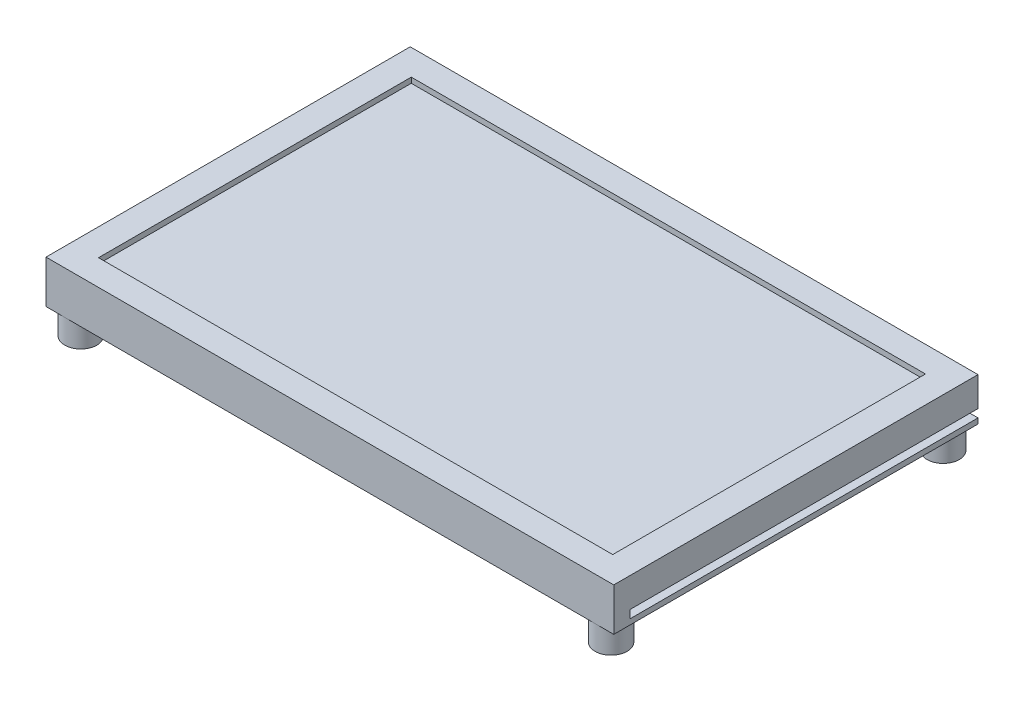
ISO-10303-21;
HEADER;
FILE_DESCRIPTION(('STEP AP214'),'2;1');
FILE_NAME('part.step','',(''),(''),'','','');
FILE_SCHEMA(('AUTOMOTIVE_DESIGN { 1 0 10303 214 1 1 1 1 }'));
ENDSEC;
DATA;
#1=APPLICATION_CONTEXT('core data for automotive mechanical design processes');
#2=APPLICATION_PROTOCOL_DEFINITION('international standard','automotive_design',2000,#1);
#3=PRODUCT_CONTEXT('',#1,'mechanical');
#4=PRODUCT('Part','Part','',(#3));
#5=PRODUCT_RELATED_PRODUCT_CATEGORY('part','',(#4));
#6=PRODUCT_DEFINITION_FORMATION('','',#4);
#7=PRODUCT_DEFINITION_CONTEXT('part definition',#1,'design');
#8=PRODUCT_DEFINITION('design','',#6,#7);
#9=PRODUCT_DEFINITION_SHAPE('','',#8);
#10=(LENGTH_UNIT() NAMED_UNIT(*) SI_UNIT(.MILLI.,.METRE.));
#11=(NAMED_UNIT(*) PLANE_ANGLE_UNIT() SI_UNIT($,.RADIAN.));
#12=(NAMED_UNIT(*) SI_UNIT($,.STERADIAN.) SOLID_ANGLE_UNIT());
#13=UNCERTAINTY_MEASURE_WITH_UNIT(LENGTH_MEASURE(1.E-05),#10,'distance_accuracy_value','');
#14=(GEOMETRIC_REPRESENTATION_CONTEXT(3) GLOBAL_UNCERTAINTY_ASSIGNED_CONTEXT((#13)) GLOBAL_UNIT_ASSIGNED_CONTEXT((#10,
#11,#12)) REPRESENTATION_CONTEXT('',''));
#15=CARTESIAN_POINT('',(0.,0.,0.));
#16=DIRECTION('',(0.,0.,1.));
#17=DIRECTION('',(1.,0.,0.));
#18=AXIS2_PLACEMENT_3D('',#15,#16,#17);
#19=CARTESIAN_POINT('',(-53.,8.,-34.));
#20=DIRECTION('',(0.,0.,1.));
#21=DIRECTION('',(1.,0.,0.));
#22=AXIS2_PLACEMENT_3D('',#19,#20,#21);
#23=PLANE('',#22);
#24=DIRECTION('',(0.,-1.,0.));
#25=VECTOR('',#24,1.);
#26=CARTESIAN_POINT('',(53.,8.,-34.));
#27=LINE('',#26,#25);
#28=CARTESIAN_POINT('',(53.,8.,-34.));
#29=VERTEX_POINT('',#28);
#30=CARTESIAN_POINT('',(53.,2.5,-34.));
#31=VERTEX_POINT('',#30);
#32=EDGE_CURVE('E364',#29,#31,#27,.T.);
#33=ORIENTED_EDGE('',*,*,#32,.T.);
#34=DIRECTION('',(1.,0.,0.));
#35=VECTOR('',#34,1.);
#36=CARTESIAN_POINT('',(53.,2.5,-34.));
#37=LINE('',#36,#35);
#38=CARTESIAN_POINT('',(-53.,2.5,-34.));
#39=VERTEX_POINT('',#38);
#40=EDGE_CURVE('E212',#39,#31,#37,.T.);
#41=ORIENTED_EDGE('',*,*,#40,.F.);
#42=DIRECTION('',(0.,-1.,0.));
#43=VECTOR('',#42,1.);
#44=CARTESIAN_POINT('',(-53.,8.,-34.));
#45=LINE('',#44,#43);
#46=CARTESIAN_POINT('',(-53.,8.,-34.));
#47=VERTEX_POINT('',#46);
#48=EDGE_CURVE('E360',#47,#39,#45,.T.);
#49=ORIENTED_EDGE('',*,*,#48,.F.);
#50=DIRECTION('',(-1.,0.,0.));
#51=VECTOR('',#50,1.);
#52=CARTESIAN_POINT('',(-53.,8.,-34.));
#53=LINE('',#52,#51);
#54=EDGE_CURVE('E335',#29,#47,#53,.T.);
#55=ORIENTED_EDGE('',*,*,#54,.F.);
#56=EDGE_LOOP('',(#33,#41,#49,#55));
#57=FACE_BOUND('',#56,.T.);
#58=ADVANCED_FACE('F43',(#57),#23,.F.);
#59=CARTESIAN_POINT('',(53.,8.,-34.));
#60=DIRECTION('',(-1.,0.,0.));
#61=DIRECTION('',(0.,0.,1.));
#62=AXIS2_PLACEMENT_3D('',#59,#60,#61);
#63=PLANE('',#62);
#64=DIRECTION('',(0.,-1.,0.));
#65=VECTOR('',#64,1.);
#66=CARTESIAN_POINT('',(53.,1.,31.));
#67=LINE('',#66,#65);
#68=CARTESIAN_POINT('',(53.,2.5,31.));
#69=VERTEX_POINT('',#68);
#70=CARTESIAN_POINT('',(53.,1.,31.));
#71=VERTEX_POINT('',#70);
#72=EDGE_CURVE('E208',#69,#71,#67,.T.);
#73=ORIENTED_EDGE('',*,*,#72,.F.);
#74=DIRECTION('',(0.,0.,-1.));
#75=VECTOR('',#74,1.);
#76=CARTESIAN_POINT('',(53.,2.5,31.));
#77=LINE('',#76,#75);
#78=EDGE_CURVE('E225',#69,#31,#77,.T.);
#79=ORIENTED_EDGE('',*,*,#78,.T.);
#80=ORIENTED_EDGE('',*,*,#32,.F.);
#81=DIRECTION('',(0.,0.,-1.));
#82=VECTOR('',#81,1.);
#83=CARTESIAN_POINT('',(53.,8.,-34.));
#84=LINE('',#83,#82);
#85=CARTESIAN_POINT('',(53.,8.,34.));
#86=VERTEX_POINT('',#85);
#87=EDGE_CURVE('E332',#86,#29,#84,.T.);
#88=ORIENTED_EDGE('',*,*,#87,.F.);
#89=DIRECTION('',(0.,-1.,0.));
#90=VECTOR('',#89,1.);
#91=CARTESIAN_POINT('',(53.,8.,34.));
#92=LINE('',#91,#90);
#93=CARTESIAN_POINT('',(53.,0.,34.));
#94=VERTEX_POINT('',#93);
#95=EDGE_CURVE('E342',#86,#94,#92,.T.);
#96=ORIENTED_EDGE('',*,*,#95,.T.);
#97=DIRECTION('',(0.,0.,-1.));
#98=VECTOR('',#97,1.);
#99=CARTESIAN_POINT('',(53.,0.,-34.));
#100=LINE('',#99,#98);
#101=CARTESIAN_POINT('',(53.,0.,-34.));
#102=VERTEX_POINT('',#101);
#103=EDGE_CURVE('E329',#94,#102,#100,.T.);
#104=ORIENTED_EDGE('',*,*,#103,.T.);
#105=CARTESIAN_POINT('',(53.,1.,-34.));
#106=VERTEX_POINT('',#105);
#107=EDGE_CURVE('E363',#106,#102,#27,.T.);
#108=ORIENTED_EDGE('',*,*,#107,.F.);
#109=DIRECTION('',(0.,0.,-1.));
#110=VECTOR('',#109,1.);
#111=CARTESIAN_POINT('',(53.,1.,31.));
#112=LINE('',#111,#110);
#113=EDGE_CURVE('E221',#71,#106,#112,.T.);
#114=ORIENTED_EDGE('',*,*,#113,.F.);
#115=EDGE_LOOP('',(#73,#79,#80,#88,#96,#104,#108,#114));
#116=FACE_BOUND('',#115,.T.);
#117=ADVANCED_FACE('F45',(#116),#63,.F.);
#118=CARTESIAN_POINT('',(-53.,1.,-34.));
#119=VERTEX_POINT('',#118);
#120=CARTESIAN_POINT('',(-53.,0.,-34.));
#121=VERTEX_POINT('',#120);
#122=EDGE_CURVE('E359',#119,#121,#45,.T.);
#123=ORIENTED_EDGE('',*,*,#122,.F.);
#124=DIRECTION('',(-1.,0.,0.));
#125=VECTOR('',#124,1.);
#126=CARTESIAN_POINT('',(53.,1.,-34.));
#127=LINE('',#126,#125);
#128=EDGE_CURVE('E204',#106,#119,#127,.T.);
#129=ORIENTED_EDGE('',*,*,#128,.F.);
#130=ORIENTED_EDGE('',*,*,#107,.T.);
#131=DIRECTION('',(-1.,0.,0.));
#132=VECTOR('',#131,1.);
#133=CARTESIAN_POINT('',(-53.,0.,-34.));
#134=LINE('',#133,#132);
#135=CARTESIAN_POINT('',(49.5,0.,-34.));
#136=VERTEX_POINT('',#135);
#137=EDGE_CURVE('E346',#102,#136,#134,.T.);
#138=ORIENTED_EDGE('',*,*,#137,.T.);
#139=CARTESIAN_POINT('',(-49.5,0.,-34.));
#140=VERTEX_POINT('',#139);
#141=EDGE_CURVE('E349',#136,#140,#134,.T.);
#142=ORIENTED_EDGE('',*,*,#141,.T.);
#143=EDGE_CURVE('E345',#140,#121,#134,.T.);
#144=ORIENTED_EDGE('',*,*,#143,.T.);
#145=EDGE_LOOP('',(#123,#129,#130,#138,#142,#144));
#146=FACE_BOUND('',#145,.T.);
#147=ADVANCED_FACE('F420',(#146),#23,.F.);
#148=CARTESIAN_POINT('',(-53.,8.,-34.));
#149=DIRECTION('',(1.,0.,0.));
#150=DIRECTION('',(0.,0.,-1.));
#151=AXIS2_PLACEMENT_3D('',#148,#149,#150);
#152=PLANE('',#151);
#153=ORIENTED_EDGE('',*,*,#48,.T.);
#154=DIRECTION('',(0.,0.,-1.));
#155=VECTOR('',#154,1.);
#156=CARTESIAN_POINT('',(-53.,2.5,31.));
#157=LINE('',#156,#155);
#158=CARTESIAN_POINT('',(-53.,2.5,31.));
#159=VERTEX_POINT('',#158);
#160=EDGE_CURVE('E229',#159,#39,#157,.T.);
#161=ORIENTED_EDGE('',*,*,#160,.F.);
#162=DIRECTION('',(0.,1.,0.));
#163=VECTOR('',#162,1.);
#164=CARTESIAN_POINT('',(-53.,1.,31.));
#165=LINE('',#164,#163);
#166=CARTESIAN_POINT('',(-53.,1.,31.));
#167=VERTEX_POINT('',#166);
#168=EDGE_CURVE('E215',#167,#159,#165,.T.);
#169=ORIENTED_EDGE('',*,*,#168,.F.);
#170=DIRECTION('',(0.,0.,-1.));
#171=VECTOR('',#170,1.);
#172=CARTESIAN_POINT('',(-53.,1.,31.));
#173=LINE('',#172,#171);
#174=EDGE_CURVE('E66',#167,#119,#173,.T.);
#175=ORIENTED_EDGE('',*,*,#174,.T.);
#176=ORIENTED_EDGE('',*,*,#122,.T.);
#177=DIRECTION('',(0.,0.,1.));
#178=VECTOR('',#177,1.);
#179=CARTESIAN_POINT('',(-53.,0.,-34.));
#180=LINE('',#179,#178);
#181=CARTESIAN_POINT('',(-53.,0.,34.));
#182=VERTEX_POINT('',#181);
#183=EDGE_CURVE('E348',#121,#182,#180,.T.);
#184=ORIENTED_EDGE('',*,*,#183,.T.);
#185=DIRECTION('',(0.,-1.,0.));
#186=VECTOR('',#185,1.);
#187=CARTESIAN_POINT('',(-53.,8.,34.));
#188=LINE('',#187,#186);
#189=CARTESIAN_POINT('',(-53.,8.,34.));
#190=VERTEX_POINT('',#189);
#191=EDGE_CURVE('E356',#190,#182,#188,.T.);
#192=ORIENTED_EDGE('',*,*,#191,.F.);
#193=DIRECTION('',(0.,0.,1.));
#194=VECTOR('',#193,1.);
#195=CARTESIAN_POINT('',(-53.,8.,-34.));
#196=LINE('',#195,#194);
#197=EDGE_CURVE('E338',#47,#190,#196,.T.);
#198=ORIENTED_EDGE('',*,*,#197,.F.);
#199=EDGE_LOOP('',(#153,#161,#169,#175,#176,#184,#192,#198));
#200=FACE_BOUND('',#199,.T.);
#201=ADVANCED_FACE('F427',(#200),#152,.F.);
#202=CARTESIAN_POINT('',(-53.,8.,34.));
#203=DIRECTION('',(0.,0.,-1.));
#204=DIRECTION('',(-1.,0.,0.));
#205=AXIS2_PLACEMENT_3D('',#202,#203,#204);
#206=PLANE('',#205);
#207=DIRECTION('',(1.,0.,0.));
#208=VECTOR('',#207,1.);
#209=CARTESIAN_POINT('',(-53.,0.,34.));
#210=LINE('',#209,#208);
#211=CARTESIAN_POINT('',(-49.5,0.,34.));
#212=VERTEX_POINT('',#211);
#213=EDGE_CURVE('E336',#182,#212,#210,.T.);
#214=ORIENTED_EDGE('',*,*,#213,.T.);
#215=CARTESIAN_POINT('',(49.5,0.,34.));
#216=VERTEX_POINT('',#215);
#217=EDGE_CURVE('E353',#212,#216,#210,.T.);
#218=ORIENTED_EDGE('',*,*,#217,.T.);
#219=EDGE_CURVE('E351',#216,#94,#210,.T.);
#220=ORIENTED_EDGE('',*,*,#219,.T.);
#221=ORIENTED_EDGE('',*,*,#95,.F.);
#222=DIRECTION('',(1.,0.,0.));
#223=VECTOR('',#222,1.);
#224=CARTESIAN_POINT('',(-53.,8.,34.));
#225=LINE('',#224,#223);
#226=EDGE_CURVE('E340',#190,#86,#225,.T.);
#227=ORIENTED_EDGE('',*,*,#226,.F.);
#228=ORIENTED_EDGE('',*,*,#191,.T.);
#229=EDGE_LOOP('',(#214,#218,#220,#221,#227,#228));
#230=FACE_BOUND('',#229,.T.);
#231=ADVANCED_FACE('F399',(#230),#206,.F.);
#232=CARTESIAN_POINT('',(0.,8.,0.));
#233=DIRECTION('',(0.,1.,0.));
#234=DIRECTION('',(0.,0.,1.));
#235=AXIS2_PLACEMENT_3D('',#232,#233,#234);
#236=PLANE('',#235);
#237=DIRECTION('',(0.,0.,-1.));
#238=VECTOR('',#237,1.);
#239=CARTESIAN_POINT('',(48.,8.,-29.1952443122196));
#240=LINE('',#239,#238);
#241=CARTESIAN_POINT('',(48.,8.,29.1952443122196));
#242=VERTEX_POINT('',#241);
#243=CARTESIAN_POINT('',(48.,8.,-29.1952443122196));
#244=VERTEX_POINT('',#243);
#245=EDGE_CURVE('E58',#242,#244,#240,.T.);
#246=ORIENTED_EDGE('',*,*,#245,.F.);
#247=DIRECTION('',(1.,0.,0.));
#248=VECTOR('',#247,1.);
#249=CARTESIAN_POINT('',(-48.,8.,29.1952443122196));
#250=LINE('',#249,#248);
#251=CARTESIAN_POINT('',(-48.,8.,29.1952443122196));
#252=VERTEX_POINT('',#251);
#253=EDGE_CURVE('E189',#252,#242,#250,.T.);
#254=ORIENTED_EDGE('',*,*,#253,.F.);
#255=DIRECTION('',(0.,0.,1.));
#256=VECTOR('',#255,1.);
#257=CARTESIAN_POINT('',(-48.,8.,-29.1952443122196));
#258=LINE('',#257,#256);
#259=CARTESIAN_POINT('',(-48.,8.,-29.1952443122196));
#260=VERTEX_POINT('',#259);
#261=EDGE_CURVE('E192',#260,#252,#258,.T.);
#262=ORIENTED_EDGE('',*,*,#261,.F.);
#263=DIRECTION('',(-1.,0.,0.));
#264=VECTOR('',#263,1.);
#265=CARTESIAN_POINT('',(-48.,8.,-29.1952443122196));
#266=LINE('',#265,#264);
#267=EDGE_CURVE('E198',#244,#260,#266,.T.);
#268=ORIENTED_EDGE('',*,*,#267,.F.);
#269=EDGE_LOOP('',(#246,#254,#262,#268));
#270=FACE_BOUND('',#269,.T.);
#271=ORIENTED_EDGE('',*,*,#87,.T.);
#272=ORIENTED_EDGE('',*,*,#54,.T.);
#273=ORIENTED_EDGE('',*,*,#197,.T.);
#274=ORIENTED_EDGE('',*,*,#226,.T.);
#275=EDGE_LOOP('',(#271,#272,#273,#274));
#276=FACE_BOUND('',#275,.T.);
#277=ADVANCED_FACE('F384',(#270,#276),#236,.T.);
#278=CARTESIAN_POINT('',(0.,0.,0.));
#279=DIRECTION('',(0.,1.,0.));
#280=DIRECTION('',(0.,0.,1.));
#281=AXIS2_PLACEMENT_3D('',#278,#279,#280);
#282=PLANE('',#281);
#283=CARTESIAN_POINT('',(-30.5,0.,-24.5));
#284=DIRECTION('',(0.,1.,0.));
#285=DIRECTION('',(0.,0.,1.));
#286=AXIS2_PLACEMENT_3D('',#283,#284,#285);
#287=CIRCLE('',#286,3.);
#288=CARTESIAN_POINT('',(-30.5,0.,-21.5));
#289=VERTEX_POINT('',#288);
#290=EDGE_CURVE('E51',#289,#289,#287,.F.);
#291=ORIENTED_EDGE('',*,*,#290,.F.);
#292=EDGE_LOOP('',(#291));
#293=FACE_BOUND('',#292,.T.);
#294=CARTESIAN_POINT('',(27.5,0.,-24.5));
#295=DIRECTION('',(0.,1.,0.));
#296=DIRECTION('',(0.,0.,1.));
#297=AXIS2_PLACEMENT_3D('',#294,#295,#296);
#298=CIRCLE('',#297,3.);
#299=CARTESIAN_POINT('',(27.5,0.,-21.5));
#300=VERTEX_POINT('',#299);
#301=EDGE_CURVE('E373',#300,#300,#298,.F.);
#302=ORIENTED_EDGE('',*,*,#301,.F.);
#303=EDGE_LOOP('',(#302));
#304=FACE_BOUND('',#303,.T.);
#305=CARTESIAN_POINT('',(27.5,0.,24.5));
#306=DIRECTION('',(0.,1.,0.));
#307=DIRECTION('',(0.,0.,1.));
#308=AXIS2_PLACEMENT_3D('',#305,#306,#307);
#309=CIRCLE('',#308,3.);
#310=CARTESIAN_POINT('',(27.5,0.,27.5));
#311=VERTEX_POINT('',#310);
#312=EDGE_CURVE('E370',#311,#311,#309,.F.);
#313=ORIENTED_EDGE('',*,*,#312,.F.);
#314=EDGE_LOOP('',(#313));
#315=FACE_BOUND('',#314,.T.);
#316=CARTESIAN_POINT('',(-30.5,0.,24.5));
#317=DIRECTION('',(0.,1.,0.));
#318=DIRECTION('',(0.,0.,1.));
#319=AXIS2_PLACEMENT_3D('',#316,#317,#318);
#320=CIRCLE('',#319,3.);
#321=CARTESIAN_POINT('',(-30.5,0.,27.5));
#322=VERTEX_POINT('',#321);
#323=EDGE_CURVE('E367',#322,#322,#320,.F.);
#324=ORIENTED_EDGE('',*,*,#323,.F.);
#325=EDGE_LOOP('',(#324));
#326=FACE_BOUND('',#325,.T.);
#327=ORIENTED_EDGE('',*,*,#219,.F.);
#328=CARTESIAN_POINT('',(49.5,0.,31.));
#329=DIRECTION('',(0.,-1.,0.));
#330=DIRECTION('',(0.,0.,1.));
#331=AXIS2_PLACEMENT_3D('',#328,#329,#330);
#332=CIRCLE('',#331,3.00000000000001);
#333=EDGE_CURVE('E308',#216,#216,#332,.T.);
#334=ORIENTED_EDGE('',*,*,#333,.F.);
#335=ORIENTED_EDGE('',*,*,#217,.F.);
#336=CARTESIAN_POINT('',(-49.5,0.,31.));
#337=DIRECTION('',(0.,-1.,0.));
#338=DIRECTION('',(0.,0.,-1.));
#339=AXIS2_PLACEMENT_3D('',#336,#337,#338);
#340=CIRCLE('',#339,3.00000000000001);
#341=EDGE_CURVE('E323',#212,#212,#340,.T.);
#342=ORIENTED_EDGE('',*,*,#341,.F.);
#343=ORIENTED_EDGE('',*,*,#213,.F.);
#344=ORIENTED_EDGE('',*,*,#183,.F.);
#345=ORIENTED_EDGE('',*,*,#143,.F.);
#346=CARTESIAN_POINT('',(-49.5,0.,-31.));
#347=DIRECTION('',(0.,-1.,0.));
#348=DIRECTION('',(0.,0.,1.));
#349=AXIS2_PLACEMENT_3D('',#346,#347,#348);
#350=CIRCLE('',#349,3.00000000000001);
#351=EDGE_CURVE('E320',#140,#140,#350,.T.);
#352=ORIENTED_EDGE('',*,*,#351,.F.);
#353=ORIENTED_EDGE('',*,*,#141,.F.);
#354=CARTESIAN_POINT('',(49.5,0.,-31.));
#355=DIRECTION('',(0.,-1.,0.));
#356=DIRECTION('',(0.,0.,-1.));
#357=AXIS2_PLACEMENT_3D('',#354,#355,#356);
#358=CIRCLE('',#357,3.00000000000001);
#359=EDGE_CURVE('E314',#136,#136,#358,.T.);
#360=ORIENTED_EDGE('',*,*,#359,.F.);
#361=ORIENTED_EDGE('',*,*,#137,.F.);
#362=ORIENTED_EDGE('',*,*,#103,.F.);
#363=EDGE_LOOP('',(#327,#334,#335,#342,#343,#344,#345,#352,#353,#360,#361,#362));
#364=FACE_BOUND('',#363,.T.);
#365=ADVANCED_FACE('F380',(#293,#304,#315,#326,#364),#282,.F.);
#366=CARTESIAN_POINT('',(-49.5,-4.5,31.));
#367=DIRECTION('',(0.,1.,0.));
#368=DIRECTION('',(0.,0.,1.));
#369=AXIS2_PLACEMENT_3D('',#366,#367,#368);
#370=CYLINDRICAL_SURFACE('',#369,3.00000000000001);
#371=CARTESIAN_POINT('',(-49.5,-4.5,31.));
#372=DIRECTION('',(0.,-1.,0.));
#373=DIRECTION('',(0.,0.,-1.));
#374=AXIS2_PLACEMENT_3D('',#371,#372,#373);
#375=CIRCLE('',#374,3.00000000000001);
#376=CARTESIAN_POINT('',(-49.5,-4.5,28.));
#377=VERTEX_POINT('',#376);
#378=EDGE_CURVE('E326',#377,#377,#375,.T.);
#379=ORIENTED_EDGE('',*,*,#378,.F.);
#380=EDGE_LOOP('',(#379));
#381=FACE_BOUND('',#380,.T.);
#382=ORIENTED_EDGE('',*,*,#341,.T.);
#383=EDGE_LOOP('',(#382));
#384=FACE_BOUND('',#383,.T.);
#385=ADVANCED_FACE('F383',(#381,#384),#370,.T.);
#386=CARTESIAN_POINT('',(-49.5,-4.5,31.));
#387=DIRECTION('',(0.,-1.,0.));
#388=DIRECTION('',(0.,0.,-1.));
#389=AXIS2_PLACEMENT_3D('',#386,#387,#388);
#390=PLANE('',#389);
#391=CARTESIAN_POINT('',(-49.5,-4.5,31.));
#392=DIRECTION('',(0.,-1.,0.));
#393=DIRECTION('',(0.,0.,-1.));
#394=AXIS2_PLACEMENT_3D('',#391,#392,#393);
#395=CIRCLE('',#394,1.25);
#396=CARTESIAN_POINT('',(-49.5,-4.5,29.75));
#397=VERTEX_POINT('',#396);
#398=EDGE_CURVE('E278',#397,#397,#395,.T.);
#399=ORIENTED_EDGE('',*,*,#398,.F.);
#400=EDGE_LOOP('',(#399));
#401=FACE_BOUND('',#400,.T.);
#402=ORIENTED_EDGE('',*,*,#378,.T.);
#403=EDGE_LOOP('',(#402));
#404=FACE_BOUND('',#403,.T.);
#405=ADVANCED_FACE('F405',(#401,#404),#390,.T.);
#406=CARTESIAN_POINT('',(-49.5,-4.5,-31.));
#407=DIRECTION('',(0.,1.,0.));
#408=DIRECTION('',(0.,0.,1.));
#409=AXIS2_PLACEMENT_3D('',#406,#407,#408);
#410=CYLINDRICAL_SURFACE('',#409,3.00000000000001);
#411=CARTESIAN_POINT('',(-49.5,-4.5,-31.));
#412=DIRECTION('',(0.,-1.,0.));
#413=DIRECTION('',(0.,0.,1.));
#414=AXIS2_PLACEMENT_3D('',#411,#412,#413);
#415=CIRCLE('',#414,3.00000000000001);
#416=CARTESIAN_POINT('',(-49.5,-4.5,-28.));
#417=VERTEX_POINT('',#416);
#418=EDGE_CURVE('E317',#417,#417,#415,.T.);
#419=ORIENTED_EDGE('',*,*,#418,.F.);
#420=EDGE_LOOP('',(#419));
#421=FACE_BOUND('',#420,.T.);
#422=ORIENTED_EDGE('',*,*,#351,.T.);
#423=EDGE_LOOP('',(#422));
#424=FACE_BOUND('',#423,.T.);
#425=ADVANCED_FACE('F413',(#421,#424),#410,.T.);
#426=CARTESIAN_POINT('',(-49.5,-4.5,-31.));
#427=DIRECTION('',(0.,1.,0.));
#428=DIRECTION('',(0.,0.,1.));
#429=AXIS2_PLACEMENT_3D('',#426,#427,#428);
#430=PLANE('',#429);
#431=CARTESIAN_POINT('',(-49.5,-4.5,-31.));
#432=DIRECTION('',(0.,-1.,0.));
#433=DIRECTION('',(0.,0.,1.));
#434=AXIS2_PLACEMENT_3D('',#431,#432,#433);
#435=CIRCLE('',#434,1.25);
#436=CARTESIAN_POINT('',(-49.5,-4.5,-29.75));
#437=VERTEX_POINT('',#436);
#438=EDGE_CURVE('E285',#437,#437,#435,.T.);
#439=ORIENTED_EDGE('',*,*,#438,.F.);
#440=EDGE_LOOP('',(#439));
#441=FACE_BOUND('',#440,.T.);
#442=ORIENTED_EDGE('',*,*,#418,.T.);
#443=EDGE_LOOP('',(#442));
#444=FACE_BOUND('',#443,.T.);
#445=ADVANCED_FACE('F477',(#441,#444),#430,.F.);
#446=CARTESIAN_POINT('',(49.5,-4.5,-31.));
#447=DIRECTION('',(0.,1.,0.));
#448=DIRECTION('',(0.,0.,1.));
#449=AXIS2_PLACEMENT_3D('',#446,#447,#448);
#450=CYLINDRICAL_SURFACE('',#449,3.00000000000001);
#451=CARTESIAN_POINT('',(49.5,-4.5,-31.));
#452=DIRECTION('',(0.,-1.,0.));
#453=DIRECTION('',(0.,0.,-1.));
#454=AXIS2_PLACEMENT_3D('',#451,#452,#453);
#455=CIRCLE('',#454,3.00000000000001);
#456=CARTESIAN_POINT('',(49.5,-4.5,-34.));
#457=VERTEX_POINT('',#456);
#458=EDGE_CURVE('E311',#457,#457,#455,.T.);
#459=ORIENTED_EDGE('',*,*,#458,.F.);
#460=EDGE_LOOP('',(#459));
#461=FACE_BOUND('',#460,.T.);
#462=ORIENTED_EDGE('',*,*,#359,.T.);
#463=EDGE_LOOP('',(#462));
#464=FACE_BOUND('',#463,.T.);
#465=ADVANCED_FACE('F474',(#461,#464),#450,.T.);
#466=CARTESIAN_POINT('',(49.5,-4.5,-31.));
#467=DIRECTION('',(0.,-1.,0.));
#468=DIRECTION('',(0.,0.,-1.));
#469=AXIS2_PLACEMENT_3D('',#466,#467,#468);
#470=PLANE('',#469);
#471=CARTESIAN_POINT('',(49.5,-4.5,-31.));
#472=DIRECTION('',(0.,-1.,0.));
#473=DIRECTION('',(0.,0.,-1.));
#474=AXIS2_PLACEMENT_3D('',#471,#472,#473);
#475=CIRCLE('',#474,1.25);
#476=CARTESIAN_POINT('',(49.5,-4.5,-32.25));
#477=VERTEX_POINT('',#476);
#478=EDGE_CURVE('E282',#477,#477,#475,.T.);
#479=ORIENTED_EDGE('',*,*,#478,.F.);
#480=EDGE_LOOP('',(#479));
#481=FACE_BOUND('',#480,.T.);
#482=ORIENTED_EDGE('',*,*,#458,.T.);
#483=EDGE_LOOP('',(#482));
#484=FACE_BOUND('',#483,.T.);
#485=ADVANCED_FACE('F476',(#481,#484),#470,.T.);
#486=CARTESIAN_POINT('',(49.5,-4.5,31.));
#487=DIRECTION('',(0.,1.,0.));
#488=DIRECTION('',(0.,0.,1.));
#489=AXIS2_PLACEMENT_3D('',#486,#487,#488);
#490=CYLINDRICAL_SURFACE('',#489,3.00000000000001);
#491=CARTESIAN_POINT('',(49.5,-4.5,31.));
#492=DIRECTION('',(0.,-1.,0.));
#493=DIRECTION('',(0.,0.,1.));
#494=AXIS2_PLACEMENT_3D('',#491,#492,#493);
#495=CIRCLE('',#494,3.00000000000001);
#496=CARTESIAN_POINT('',(49.5,-4.5,34.));
#497=VERTEX_POINT('',#496);
#498=EDGE_CURVE('E307',#497,#497,#495,.T.);
#499=ORIENTED_EDGE('',*,*,#498,.F.);
#500=EDGE_LOOP('',(#499));
#501=FACE_BOUND('',#500,.T.);
#502=ORIENTED_EDGE('',*,*,#333,.T.);
#503=EDGE_LOOP('',(#502));
#504=FACE_BOUND('',#503,.T.);
#505=ADVANCED_FACE('F484',(#501,#504),#490,.T.);
#506=CARTESIAN_POINT('',(49.5,-4.5,31.));
#507=DIRECTION('',(0.,1.,0.));
#508=DIRECTION('',(0.,0.,1.));
#509=AXIS2_PLACEMENT_3D('',#506,#507,#508);
#510=PLANE('',#509);
#511=CARTESIAN_POINT('',(49.5,-4.5,31.));
#512=DIRECTION('',(0.,-1.,0.));
#513=DIRECTION('',(0.,0.,1.));
#514=AXIS2_PLACEMENT_3D('',#511,#512,#513);
#515=CIRCLE('',#514,1.25);
#516=CARTESIAN_POINT('',(49.5,-4.5,32.25));
#517=VERTEX_POINT('',#516);
#518=EDGE_CURVE('E275',#517,#517,#515,.T.);
#519=ORIENTED_EDGE('',*,*,#518,.F.);
#520=EDGE_LOOP('',(#519));
#521=FACE_BOUND('',#520,.T.);
#522=ORIENTED_EDGE('',*,*,#498,.T.);
#523=EDGE_LOOP('',(#522));
#524=FACE_BOUND('',#523,.T.);
#525=ADVANCED_FACE('F492',(#521,#524),#510,.F.);
#526=CARTESIAN_POINT('',(-30.5,-4.5,24.5));
#527=DIRECTION('',(0.,1.,0.));
#528=DIRECTION('',(0.,0.,1.));
#529=AXIS2_PLACEMENT_3D('',#526,#527,#528);
#530=CYLINDRICAL_SURFACE('',#529,3.);
#531=CARTESIAN_POINT('',(-30.5,-4.5,24.5));
#532=DIRECTION('',(0.,-1.,0.));
#533=DIRECTION('',(0.,0.,-1.));
#534=AXIS2_PLACEMENT_3D('',#531,#532,#533);
#535=CIRCLE('',#534,3.);
#536=CARTESIAN_POINT('',(-30.5,-4.5,21.5));
#537=VERTEX_POINT('',#536);
#538=EDGE_CURVE('E304',#537,#537,#535,.T.);
#539=ORIENTED_EDGE('',*,*,#538,.F.);
#540=EDGE_LOOP('',(#539));
#541=FACE_BOUND('',#540,.T.);
#542=ORIENTED_EDGE('',*,*,#323,.T.);
#543=EDGE_LOOP('',(#542));
#544=FACE_BOUND('',#543,.T.);
#545=ADVANCED_FACE('F539',(#541,#544),#530,.T.);
#546=CARTESIAN_POINT('',(-30.5,-4.5,24.5));
#547=DIRECTION('',(0.,-1.,0.));
#548=DIRECTION('',(0.,0.,-1.));
#549=AXIS2_PLACEMENT_3D('',#546,#547,#548);
#550=PLANE('',#549);
#551=CARTESIAN_POINT('',(-30.5,-4.5,24.5));
#552=DIRECTION('',(0.,-1.,0.));
#553=DIRECTION('',(0.,0.,-1.));
#554=AXIS2_PLACEMENT_3D('',#551,#552,#553);
#555=CIRCLE('',#554,1.25);
#556=CARTESIAN_POINT('',(-30.5,-4.5,23.25));
#557=VERTEX_POINT('',#556);
#558=EDGE_CURVE('E269',#557,#557,#555,.T.);
#559=ORIENTED_EDGE('',*,*,#558,.F.);
#560=EDGE_LOOP('',(#559));
#561=FACE_BOUND('',#560,.T.);
#562=ORIENTED_EDGE('',*,*,#538,.T.);
#563=EDGE_LOOP('',(#562));
#564=FACE_BOUND('',#563,.T.);
#565=ADVANCED_FACE('F548',(#561,#564),#550,.T.);
#566=CARTESIAN_POINT('',(27.5,-4.5,24.5));
#567=DIRECTION('',(0.,1.,0.));
#568=DIRECTION('',(0.,0.,1.));
#569=AXIS2_PLACEMENT_3D('',#566,#567,#568);
#570=CYLINDRICAL_SURFACE('',#569,3.);
#571=CARTESIAN_POINT('',(27.5,-4.5,24.5));
#572=DIRECTION('',(0.,-1.,0.));
#573=DIRECTION('',(0.,0.,-1.));
#574=AXIS2_PLACEMENT_3D('',#571,#572,#573);
#575=CIRCLE('',#574,3.);
#576=CARTESIAN_POINT('',(27.5,-4.5,21.5));
#577=VERTEX_POINT('',#576);
#578=EDGE_CURVE('E301',#577,#577,#575,.T.);
#579=ORIENTED_EDGE('',*,*,#578,.F.);
#580=EDGE_LOOP('',(#579));
#581=FACE_BOUND('',#580,.T.);
#582=ORIENTED_EDGE('',*,*,#312,.T.);
#583=EDGE_LOOP('',(#582));
#584=FACE_BOUND('',#583,.T.);
#585=ADVANCED_FACE('F558',(#581,#584),#570,.T.);
#586=CARTESIAN_POINT('',(27.5,-4.5,24.5));
#587=DIRECTION('',(0.,-1.,0.));
#588=DIRECTION('',(0.,0.,-1.));
#589=AXIS2_PLACEMENT_3D('',#586,#587,#588);
#590=PLANE('',#589);
#591=CARTESIAN_POINT('',(27.5,-4.5,24.5));
#592=DIRECTION('',(0.,-1.,0.));
#593=DIRECTION('',(0.,0.,1.));
#594=AXIS2_PLACEMENT_3D('',#591,#592,#593);
#595=CIRCLE('',#594,1.24999999999995);
#596=CARTESIAN_POINT('',(27.5,-4.5,25.7499999999999));
#597=VERTEX_POINT('',#596);
#598=EDGE_CURVE('E266',#597,#597,#595,.T.);
#599=ORIENTED_EDGE('',*,*,#598,.F.);
#600=EDGE_LOOP('',(#599));
#601=FACE_BOUND('',#600,.T.);
#602=ORIENTED_EDGE('',*,*,#578,.T.);
#603=EDGE_LOOP('',(#602));
#604=FACE_BOUND('',#603,.T.);
#605=ADVANCED_FACE('F568',(#601,#604),#590,.T.);
#606=CARTESIAN_POINT('',(27.5,-4.5,-24.5));
#607=DIRECTION('',(0.,1.,0.));
#608=DIRECTION('',(0.,0.,1.));
#609=AXIS2_PLACEMENT_3D('',#606,#607,#608);
#610=CYLINDRICAL_SURFACE('',#609,3.);
#611=CARTESIAN_POINT('',(27.5,-4.5,-24.5));
#612=DIRECTION('',(0.,-1.,0.));
#613=DIRECTION('',(0.,0.,1.));
#614=AXIS2_PLACEMENT_3D('',#611,#612,#613);
#615=CIRCLE('',#614,3.);
#616=CARTESIAN_POINT('',(27.5,-4.5,-21.5));
#617=VERTEX_POINT('',#616);
#618=EDGE_CURVE('E298',#617,#617,#615,.T.);
#619=ORIENTED_EDGE('',*,*,#618,.F.);
#620=EDGE_LOOP('',(#619));
#621=FACE_BOUND('',#620,.T.);
#622=ORIENTED_EDGE('',*,*,#301,.T.);
#623=EDGE_LOOP('',(#622));
#624=FACE_BOUND('',#623,.T.);
#625=ADVANCED_FACE('F578',(#621,#624),#610,.T.);
#626=CARTESIAN_POINT('',(27.5,-4.5,-24.5));
#627=DIRECTION('',(0.,1.,0.));
#628=DIRECTION('',(0.,0.,1.));
#629=AXIS2_PLACEMENT_3D('',#626,#627,#628);
#630=PLANE('',#629);
#631=CARTESIAN_POINT('',(27.5,-4.5,-24.5));
#632=DIRECTION('',(0.,-1.,0.));
#633=DIRECTION('',(0.,0.,-1.));
#634=AXIS2_PLACEMENT_3D('',#631,#632,#633);
#635=CIRCLE('',#634,1.25000000000003);
#636=CARTESIAN_POINT('',(27.5,-4.5,-25.75));
#637=VERTEX_POINT('',#636);
#638=EDGE_CURVE('E270',#637,#637,#635,.T.);
#639=ORIENTED_EDGE('',*,*,#638,.F.);
#640=EDGE_LOOP('',(#639));
#641=FACE_BOUND('',#640,.T.);
#642=ORIENTED_EDGE('',*,*,#618,.T.);
#643=EDGE_LOOP('',(#642));
#644=FACE_BOUND('',#643,.T.);
#645=ADVANCED_FACE('F588',(#641,#644),#630,.F.);
#646=CARTESIAN_POINT('',(-30.5,-4.5,-24.5));
#647=DIRECTION('',(0.,1.,0.));
#648=DIRECTION('',(0.,0.,1.));
#649=AXIS2_PLACEMENT_3D('',#646,#647,#648);
#650=CYLINDRICAL_SURFACE('',#649,3.);
#651=CARTESIAN_POINT('',(-30.5,-4.5,-24.5));
#652=DIRECTION('',(0.,-1.,0.));
#653=DIRECTION('',(0.,0.,1.));
#654=AXIS2_PLACEMENT_3D('',#651,#652,#653);
#655=CIRCLE('',#654,3.);
#656=CARTESIAN_POINT('',(-30.5,-4.5,-21.5));
#657=VERTEX_POINT('',#656);
#658=EDGE_CURVE('E293',#657,#657,#655,.T.);
#659=ORIENTED_EDGE('',*,*,#658,.F.);
#660=EDGE_LOOP('',(#659));
#661=FACE_BOUND('',#660,.T.);
#662=ORIENTED_EDGE('',*,*,#290,.T.);
#663=EDGE_LOOP('',(#662));
#664=FACE_BOUND('',#663,.T.);
#665=ADVANCED_FACE('F378',(#661,#664),#650,.T.);
#666=CARTESIAN_POINT('',(-30.5,-4.5,-24.5));
#667=DIRECTION('',(0.,1.,0.));
#668=DIRECTION('',(0.,0.,1.));
#669=AXIS2_PLACEMENT_3D('',#666,#667,#668);
#670=PLANE('',#669);
#671=CARTESIAN_POINT('',(-30.5,-4.5,-24.5));
#672=DIRECTION('',(0.,-1.,0.));
#673=DIRECTION('',(0.,0.,1.));
#674=AXIS2_PLACEMENT_3D('',#671,#672,#673);
#675=CIRCLE('',#674,1.25);
#676=CARTESIAN_POINT('',(-30.5,-4.5,-23.25));
#677=VERTEX_POINT('',#676);
#678=EDGE_CURVE('E265',#677,#677,#675,.T.);
#679=ORIENTED_EDGE('',*,*,#678,.F.);
#680=EDGE_LOOP('',(#679));
#681=FACE_BOUND('',#680,.T.);
#682=ORIENTED_EDGE('',*,*,#658,.T.);
#683=EDGE_LOOP('',(#682));
#684=FACE_BOUND('',#683,.T.);
#685=ADVANCED_FACE('F607',(#681,#684),#670,.F.);
#686=CARTESIAN_POINT('',(-30.5,2.5,-24.5));
#687=DIRECTION('',(0.,-1.,0.));
#688=DIRECTION('',(0.,0.,-1.));
#689=AXIS2_PLACEMENT_3D('',#686,#687,#688);
#690=CYLINDRICAL_SURFACE('',#689,1.25);
#691=CARTESIAN_POINT('',(-30.5,1.,-24.5));
#692=DIRECTION('',(0.,-1.,0.));
#693=DIRECTION('',(0.,0.,-1.));
#694=AXIS2_PLACEMENT_3D('',#691,#692,#693);
#695=CIRCLE('',#694,1.25);
#696=CARTESIAN_POINT('',(-30.5,1.,-25.75));
#697=VERTEX_POINT('',#696);
#698=EDGE_CURVE('E262',#697,#697,#695,.F.);
#699=ORIENTED_EDGE('',*,*,#698,.T.);
#700=EDGE_LOOP('',(#699));
#701=FACE_BOUND('',#700,.T.);
#702=ORIENTED_EDGE('',*,*,#678,.T.);
#703=EDGE_LOOP('',(#702));
#704=FACE_BOUND('',#703,.T.);
#705=ADVANCED_FACE('F616',(#701,#704),#690,.F.);
#706=CARTESIAN_POINT('',(27.5,2.5,-24.5));
#707=DIRECTION('',(0.,-1.,0.));
#708=DIRECTION('',(0.,0.,-1.));
#709=AXIS2_PLACEMENT_3D('',#706,#707,#708);
#710=CYLINDRICAL_SURFACE('',#709,1.25000000000003);
#711=CARTESIAN_POINT('',(27.5,1.,-24.5));
#712=DIRECTION('',(0.,-1.,0.));
#713=DIRECTION('',(0.,0.,-1.));
#714=AXIS2_PLACEMENT_3D('',#711,#712,#713);
#715=CIRCLE('',#714,1.25000000000003);
#716=CARTESIAN_POINT('',(27.5,1.,-25.75));
#717=VERTEX_POINT('',#716);
#718=EDGE_CURVE('E259',#717,#717,#715,.F.);
#719=ORIENTED_EDGE('',*,*,#718,.T.);
#720=EDGE_LOOP('',(#719));
#721=FACE_BOUND('',#720,.T.);
#722=ORIENTED_EDGE('',*,*,#638,.T.);
#723=EDGE_LOOP('',(#722));
#724=FACE_BOUND('',#723,.T.);
#725=ADVANCED_FACE('F627',(#721,#724),#710,.F.);
#726=CARTESIAN_POINT('',(27.5,2.5,24.5));
#727=DIRECTION('',(0.,-1.,0.));
#728=DIRECTION('',(0.,0.,-1.));
#729=AXIS2_PLACEMENT_3D('',#726,#727,#728);
#730=CYLINDRICAL_SURFACE('',#729,1.24999999999995);
#731=CARTESIAN_POINT('',(27.5,1.,24.5));
#732=DIRECTION('',(0.,-1.,0.));
#733=DIRECTION('',(0.,0.,-1.));
#734=AXIS2_PLACEMENT_3D('',#731,#732,#733);
#735=CIRCLE('',#734,1.24999999999995);
#736=CARTESIAN_POINT('',(27.5,1.,23.2500000000001));
#737=VERTEX_POINT('',#736);
#738=EDGE_CURVE('E256',#737,#737,#735,.F.);
#739=ORIENTED_EDGE('',*,*,#738,.T.);
#740=EDGE_LOOP('',(#739));
#741=FACE_BOUND('',#740,.T.);
#742=ORIENTED_EDGE('',*,*,#598,.T.);
#743=EDGE_LOOP('',(#742));
#744=FACE_BOUND('',#743,.T.);
#745=ADVANCED_FACE('F638',(#741,#744),#730,.F.);
#746=CARTESIAN_POINT('',(-30.5,2.5,24.5));
#747=DIRECTION('',(0.,-1.,0.));
#748=DIRECTION('',(0.,0.,-1.));
#749=AXIS2_PLACEMENT_3D('',#746,#747,#748);
#750=CYLINDRICAL_SURFACE('',#749,1.25);
#751=CARTESIAN_POINT('',(-30.5,1.,24.5));
#752=DIRECTION('',(0.,-1.,0.));
#753=DIRECTION('',(0.,0.,-1.));
#754=AXIS2_PLACEMENT_3D('',#751,#752,#753);
#755=CIRCLE('',#754,1.25);
#756=CARTESIAN_POINT('',(-30.5,1.,23.25));
#757=VERTEX_POINT('',#756);
#758=EDGE_CURVE('E253',#757,#757,#755,.F.);
#759=ORIENTED_EDGE('',*,*,#758,.T.);
#760=EDGE_LOOP('',(#759));
#761=FACE_BOUND('',#760,.T.);
#762=ORIENTED_EDGE('',*,*,#558,.T.);
#763=EDGE_LOOP('',(#762));
#764=FACE_BOUND('',#763,.T.);
#765=ADVANCED_FACE('F648',(#761,#764),#750,.F.);
#766=CARTESIAN_POINT('',(49.5,2.5,31.));
#767=DIRECTION('',(0.,-1.,0.));
#768=DIRECTION('',(0.,0.,-1.));
#769=AXIS2_PLACEMENT_3D('',#766,#767,#768);
#770=CYLINDRICAL_SURFACE('',#769,1.25);
#771=CARTESIAN_POINT('',(49.5,1.,31.));
#772=DIRECTION('',(0.,-1.,0.));
#773=DIRECTION('',(0.,0.,-1.));
#774=AXIS2_PLACEMENT_3D('',#771,#772,#773);
#775=CIRCLE('',#774,1.25);
#776=CARTESIAN_POINT('',(50.75,1.,31.));
#777=VERTEX_POINT('',#776);
#778=CARTESIAN_POINT('',(48.25,1.,31.));
#779=VERTEX_POINT('',#778);
#780=EDGE_CURVE('E250',#777,#779,#775,.F.);
#781=ORIENTED_EDGE('',*,*,#780,.T.);
#782=DIRECTION('',(0.,-1.,0.));
#783=VECTOR('',#782,1.);
#784=CARTESIAN_POINT('',(48.25,2.5,31.));
#785=LINE('',#784,#783);
#786=CARTESIAN_POINT('',(48.25,2.5,31.));
#787=VERTEX_POINT('',#786);
#788=EDGE_CURVE('E241',#779,#787,#785,.F.);
#789=ORIENTED_EDGE('',*,*,#788,.T.);
#790=CARTESIAN_POINT('',(49.5,2.5,31.));
#791=DIRECTION('',(0.,-1.,0.));
#792=DIRECTION('',(0.,0.,1.));
#793=AXIS2_PLACEMENT_3D('',#790,#791,#792);
#794=CIRCLE('',#793,1.25);
#795=CARTESIAN_POINT('',(50.75,2.5,31.));
#796=VERTEX_POINT('',#795);
#797=EDGE_CURVE('E279',#796,#787,#794,.T.);
#798=ORIENTED_EDGE('',*,*,#797,.F.);
#799=DIRECTION('',(0.,-1.,0.));
#800=VECTOR('',#799,1.);
#801=CARTESIAN_POINT('',(50.75,2.5,31.));
#802=LINE('',#801,#800);
#803=EDGE_CURVE('E238',#796,#777,#802,.T.);
#804=ORIENTED_EDGE('',*,*,#803,.T.);
#805=EDGE_LOOP('',(#781,#789,#798,#804));
#806=FACE_BOUND('',#805,.T.);
#807=ORIENTED_EDGE('',*,*,#518,.T.);
#808=EDGE_LOOP('',(#807));
#809=FACE_BOUND('',#808,.T.);
#810=ADVANCED_FACE('F460',(#806,#809),#770,.F.);
#811=CARTESIAN_POINT('',(49.5,2.5,31.));
#812=DIRECTION('',(0.,1.,0.));
#813=DIRECTION('',(0.,0.,1.));
#814=AXIS2_PLACEMENT_3D('',#811,#812,#813);
#815=PLANE('',#814);
#816=ORIENTED_EDGE('',*,*,#797,.T.);
#817=DIRECTION('',(1.,0.,0.));
#818=VECTOR('',#817,1.);
#819=CARTESIAN_POINT('',(53.,2.5,31.));
#820=LINE('',#819,#818);
#821=CARTESIAN_POINT('',(-48.25,2.5,31.));
#822=VERTEX_POINT('',#821);
#823=EDGE_CURVE('E222',#822,#787,#820,.T.);
#824=ORIENTED_EDGE('',*,*,#823,.F.);
#825=CARTESIAN_POINT('',(-49.5,2.5,31.));
#826=DIRECTION('',(0.,-1.,0.));
#827=DIRECTION('',(0.,0.,-1.));
#828=AXIS2_PLACEMENT_3D('',#825,#826,#827);
#829=CIRCLE('',#828,1.25);
#830=CARTESIAN_POINT('',(-50.75,2.5,31.));
#831=VERTEX_POINT('',#830);
#832=EDGE_CURVE('E290',#822,#831,#829,.T.);
#833=ORIENTED_EDGE('',*,*,#832,.T.);
#834=EDGE_CURVE('E219',#159,#831,#820,.T.);
#835=ORIENTED_EDGE('',*,*,#834,.F.);
#836=ORIENTED_EDGE('',*,*,#160,.T.);
#837=ORIENTED_EDGE('',*,*,#40,.T.);
#838=ORIENTED_EDGE('',*,*,#78,.F.);
#839=EDGE_CURVE('E218',#796,#69,#820,.T.);
#840=ORIENTED_EDGE('',*,*,#839,.F.);
#841=EDGE_LOOP('',(#816,#824,#833,#835,#836,#837,#838,#840));
#842=FACE_BOUND('',#841,.T.);
#843=ADVANCED_FACE('F445',(#842),#815,.F.);
#844=CARTESIAN_POINT('',(49.5,2.5,-31.));
#845=DIRECTION('',(0.,-1.,0.));
#846=DIRECTION('',(0.,0.,-1.));
#847=AXIS2_PLACEMENT_3D('',#844,#845,#846);
#848=CYLINDRICAL_SURFACE('',#847,1.25);
#849=CARTESIAN_POINT('',(49.5,1.,-31.));
#850=DIRECTION('',(0.,-1.,0.));
#851=DIRECTION('',(0.,0.,-1.));
#852=AXIS2_PLACEMENT_3D('',#849,#850,#851);
#853=CIRCLE('',#852,1.25);
#854=CARTESIAN_POINT('',(49.5,1.,-32.25));
#855=VERTEX_POINT('',#854);
#856=EDGE_CURVE('E247',#855,#855,#853,.F.);
#857=ORIENTED_EDGE('',*,*,#856,.T.);
#858=EDGE_LOOP('',(#857));
#859=FACE_BOUND('',#858,.T.);
#860=ORIENTED_EDGE('',*,*,#478,.T.);
#861=EDGE_LOOP('',(#860));
#862=FACE_BOUND('',#861,.T.);
#863=ADVANCED_FACE('F676',(#859,#862),#848,.F.);
#864=CARTESIAN_POINT('',(-49.5,2.5,-31.));
#865=DIRECTION('',(0.,-1.,0.));
#866=DIRECTION('',(0.,0.,-1.));
#867=AXIS2_PLACEMENT_3D('',#864,#865,#866);
#868=CYLINDRICAL_SURFACE('',#867,1.25);
#869=CARTESIAN_POINT('',(-49.5,1.,-31.));
#870=DIRECTION('',(0.,-1.,0.));
#871=DIRECTION('',(0.,0.,-1.));
#872=AXIS2_PLACEMENT_3D('',#869,#870,#871);
#873=CIRCLE('',#872,1.25);
#874=CARTESIAN_POINT('',(-49.5,1.,-32.25));
#875=VERTEX_POINT('',#874);
#876=EDGE_CURVE('E244',#875,#875,#873,.F.);
#877=ORIENTED_EDGE('',*,*,#876,.T.);
#878=EDGE_LOOP('',(#877));
#879=FACE_BOUND('',#878,.T.);
#880=ORIENTED_EDGE('',*,*,#438,.T.);
#881=EDGE_LOOP('',(#880));
#882=FACE_BOUND('',#881,.T.);
#883=ADVANCED_FACE('F688',(#879,#882),#868,.F.);
#884=CARTESIAN_POINT('',(-49.5,2.5,31.));
#885=DIRECTION('',(0.,-1.,0.));
#886=DIRECTION('',(0.,0.,-1.));
#887=AXIS2_PLACEMENT_3D('',#884,#885,#886);
#888=CYLINDRICAL_SURFACE('',#887,1.25);
#889=CARTESIAN_POINT('',(-49.5,1.,31.));
#890=DIRECTION('',(0.,-1.,0.));
#891=DIRECTION('',(0.,0.,-1.));
#892=AXIS2_PLACEMENT_3D('',#889,#890,#891);
#893=CIRCLE('',#892,1.25);
#894=CARTESIAN_POINT('',(-48.25,1.,31.));
#895=VERTEX_POINT('',#894);
#896=CARTESIAN_POINT('',(-50.75,1.,31.));
#897=VERTEX_POINT('',#896);
#898=EDGE_CURVE('E11',#895,#897,#893,.F.);
#899=ORIENTED_EDGE('',*,*,#898,.T.);
#900=DIRECTION('',(0.,-1.,0.));
#901=VECTOR('',#900,1.);
#902=CARTESIAN_POINT('',(-50.75,2.5,31.));
#903=LINE('',#902,#901);
#904=EDGE_CURVE('E235',#897,#831,#903,.F.);
#905=ORIENTED_EDGE('',*,*,#904,.T.);
#906=ORIENTED_EDGE('',*,*,#832,.F.);
#907=DIRECTION('',(0.,-1.,0.));
#908=VECTOR('',#907,1.);
#909=CARTESIAN_POINT('',(-48.25,2.5,31.));
#910=LINE('',#909,#908);
#911=EDGE_CURVE('E228',#822,#895,#910,.T.);
#912=ORIENTED_EDGE('',*,*,#911,.T.);
#913=EDGE_LOOP('',(#899,#905,#906,#912));
#914=FACE_BOUND('',#913,.T.);
#915=ORIENTED_EDGE('',*,*,#398,.T.);
#916=EDGE_LOOP('',(#915));
#917=FACE_BOUND('',#916,.T.);
#918=ADVANCED_FACE('F450',(#914,#917),#888,.F.);
#919=CARTESIAN_POINT('',(53.,1.,31.));
#920=DIRECTION('',(0.,-1.,0.));
#921=DIRECTION('',(0.,0.,-1.));
#922=AXIS2_PLACEMENT_3D('',#919,#920,#921);
#923=PLANE('',#922);
#924=ORIENTED_EDGE('',*,*,#718,.F.);
#925=EDGE_LOOP('',(#924));
#926=FACE_BOUND('',#925,.T.);
#927=ORIENTED_EDGE('',*,*,#758,.F.);
#928=EDGE_LOOP('',(#927));
#929=FACE_BOUND('',#928,.T.);
#930=ORIENTED_EDGE('',*,*,#876,.F.);
#931=EDGE_LOOP('',(#930));
#932=FACE_BOUND('',#931,.T.);
#933=ORIENTED_EDGE('',*,*,#856,.F.);
#934=EDGE_LOOP('',(#933));
#935=FACE_BOUND('',#934,.T.);
#936=DIRECTION('',(-1.,0.,0.));
#937=VECTOR('',#936,1.);
#938=CARTESIAN_POINT('',(53.,1.,31.));
#939=LINE('',#938,#937);
#940=EDGE_CURVE('E213',#71,#777,#939,.T.);
#941=ORIENTED_EDGE('',*,*,#940,.F.);
#942=ORIENTED_EDGE('',*,*,#113,.T.);
#943=ORIENTED_EDGE('',*,*,#128,.T.);
#944=ORIENTED_EDGE('',*,*,#174,.F.);
#945=EDGE_CURVE('E211',#897,#167,#939,.T.);
#946=ORIENTED_EDGE('',*,*,#945,.F.);
#947=ORIENTED_EDGE('',*,*,#898,.F.);
#948=EDGE_CURVE('E216',#779,#895,#939,.T.);
#949=ORIENTED_EDGE('',*,*,#948,.F.);
#950=ORIENTED_EDGE('',*,*,#780,.F.);
#951=EDGE_LOOP('',(#941,#942,#943,#944,#946,#947,#949,#950));
#952=FACE_BOUND('',#951,.T.);
#953=ORIENTED_EDGE('',*,*,#738,.F.);
#954=EDGE_LOOP('',(#953));
#955=FACE_BOUND('',#954,.T.);
#956=ORIENTED_EDGE('',*,*,#698,.F.);
#957=EDGE_LOOP('',(#956));
#958=FACE_BOUND('',#957,.T.);
#959=ADVANCED_FACE('F453',(#926,#929,#932,#935,#952,#955,#958),#923,.F.);
#960=CARTESIAN_POINT('',(0.,0.,31.));
#961=DIRECTION('',(0.,0.,1.));
#962=DIRECTION('',(1.,0.,0.));
#963=AXIS2_PLACEMENT_3D('',#960,#961,#962);
#964=PLANE('',#963);
#965=ORIENTED_EDGE('',*,*,#948,.T.);
#966=ORIENTED_EDGE('',*,*,#911,.F.);
#967=ORIENTED_EDGE('',*,*,#823,.T.);
#968=ORIENTED_EDGE('',*,*,#788,.F.);
#969=EDGE_LOOP('',(#965,#966,#967,#968));
#970=FACE_BOUND('',#969,.T.);
#971=ADVANCED_FACE('F457',(#970),#964,.F.);
#972=ORIENTED_EDGE('',*,*,#839,.T.);
#973=ORIENTED_EDGE('',*,*,#72,.T.);
#974=ORIENTED_EDGE('',*,*,#940,.T.);
#975=ORIENTED_EDGE('',*,*,#803,.F.);
#976=EDGE_LOOP('',(#972,#973,#974,#975));
#977=FACE_BOUND('',#976,.T.);
#978=ADVANCED_FACE('F465',(#977),#964,.F.);
#979=ORIENTED_EDGE('',*,*,#945,.T.);
#980=ORIENTED_EDGE('',*,*,#168,.T.);
#981=ORIENTED_EDGE('',*,*,#834,.T.);
#982=ORIENTED_EDGE('',*,*,#904,.F.);
#983=EDGE_LOOP('',(#979,#980,#981,#982));
#984=FACE_BOUND('',#983,.T.);
#985=ADVANCED_FACE('F443',(#984),#964,.F.);
#986=CARTESIAN_POINT('',(48.,7.,-29.1952443122196));
#987=DIRECTION('',(1.,0.,0.));
#988=DIRECTION('',(0.,0.,-1.));
#989=AXIS2_PLACEMENT_3D('',#986,#987,#988);
#990=PLANE('',#989);
#991=ORIENTED_EDGE('',*,*,#245,.T.);
#992=DIRECTION('',(0.,1.,0.));
#993=VECTOR('',#992,1.);
#994=CARTESIAN_POINT('',(48.,7.,-29.1952443122196));
#995=LINE('',#994,#993);
#996=CARTESIAN_POINT('',(48.,7.,-29.1952443122196));
#997=VERTEX_POINT('',#996);
#998=EDGE_CURVE('E167',#997,#244,#995,.T.);
#999=ORIENTED_EDGE('',*,*,#998,.F.);
#1000=DIRECTION('',(0.,0.,-1.));
#1001=VECTOR('',#1000,1.);
#1002=CARTESIAN_POINT('',(48.,7.,-29.1952443122196));
#1003=LINE('',#1002,#1001);
#1004=CARTESIAN_POINT('',(48.,7.,29.1952443122196));
#1005=VERTEX_POINT('',#1004);
#1006=EDGE_CURVE('E171',#1005,#997,#1003,.T.);
#1007=ORIENTED_EDGE('',*,*,#1006,.F.);
#1008=DIRECTION('',(0.,1.,0.));
#1009=VECTOR('',#1008,1.);
#1010=CARTESIAN_POINT('',(48.,7.,29.1952443122196));
#1011=LINE('',#1010,#1009);
#1012=EDGE_CURVE('E202',#1005,#242,#1011,.T.);
#1013=ORIENTED_EDGE('',*,*,#1012,.T.);
#1014=EDGE_LOOP('',(#991,#999,#1007,#1013));
#1015=FACE_BOUND('',#1014,.T.);
#1016=ADVANCED_FACE('F169',(#1015),#990,.F.);
#1017=CARTESIAN_POINT('',(-48.,7.,29.1952443122196));
#1018=DIRECTION('',(0.,0.,1.));
#1019=DIRECTION('',(1.,0.,0.));
#1020=AXIS2_PLACEMENT_3D('',#1017,#1018,#1019);
#1021=PLANE('',#1020);
#1022=ORIENTED_EDGE('',*,*,#253,.T.);
#1023=ORIENTED_EDGE('',*,*,#1012,.F.);
#1024=DIRECTION('',(1.,0.,0.));
#1025=VECTOR('',#1024,1.);
#1026=CARTESIAN_POINT('',(-48.,7.,29.1952443122196));
#1027=LINE('',#1026,#1025);
#1028=CARTESIAN_POINT('',(-48.,7.,29.1952443122196));
#1029=VERTEX_POINT('',#1028);
#1030=EDGE_CURVE('E177',#1029,#1005,#1027,.T.);
#1031=ORIENTED_EDGE('',*,*,#1030,.F.);
#1032=DIRECTION('',(0.,1.,0.));
#1033=VECTOR('',#1032,1.);
#1034=CARTESIAN_POINT('',(-48.,7.,29.1952443122196));
#1035=LINE('',#1034,#1033);
#1036=EDGE_CURVE('E205',#1029,#252,#1035,.T.);
#1037=ORIENTED_EDGE('',*,*,#1036,.T.);
#1038=EDGE_LOOP('',(#1022,#1023,#1031,#1037));
#1039=FACE_BOUND('',#1038,.T.);
#1040=ADVANCED_FACE('F748',(#1039),#1021,.F.);
#1041=CARTESIAN_POINT('',(-48.,7.,-29.1952443122196));
#1042=DIRECTION('',(-1.,0.,0.));
#1043=DIRECTION('',(0.,0.,1.));
#1044=AXIS2_PLACEMENT_3D('',#1041,#1042,#1043);
#1045=PLANE('',#1044);
#1046=ORIENTED_EDGE('',*,*,#261,.T.);
#1047=ORIENTED_EDGE('',*,*,#1036,.F.);
#1048=DIRECTION('',(0.,0.,1.));
#1049=VECTOR('',#1048,1.);
#1050=CARTESIAN_POINT('',(-48.,7.,-29.1952443122196));
#1051=LINE('',#1050,#1049);
#1052=CARTESIAN_POINT('',(-48.,7.,-29.1952443122196));
#1053=VERTEX_POINT('',#1052);
#1054=EDGE_CURVE('E185',#1053,#1029,#1051,.T.);
#1055=ORIENTED_EDGE('',*,*,#1054,.F.);
#1056=DIRECTION('',(0.,1.,0.));
#1057=VECTOR('',#1056,1.);
#1058=CARTESIAN_POINT('',(-48.,7.,-29.1952443122196));
#1059=LINE('',#1058,#1057);
#1060=EDGE_CURVE('E176',#1053,#260,#1059,.T.);
#1061=ORIENTED_EDGE('',*,*,#1060,.T.);
#1062=EDGE_LOOP('',(#1046,#1047,#1055,#1061));
#1063=FACE_BOUND('',#1062,.T.);
#1064=ADVANCED_FACE('F757',(#1063),#1045,.F.);
#1065=CARTESIAN_POINT('',(-48.,7.,-29.1952443122196));
#1066=DIRECTION('',(0.,0.,-1.));
#1067=DIRECTION('',(-1.,0.,0.));
#1068=AXIS2_PLACEMENT_3D('',#1065,#1066,#1067);
#1069=PLANE('',#1068);
#1070=ORIENTED_EDGE('',*,*,#267,.T.);
#1071=ORIENTED_EDGE('',*,*,#1060,.F.);
#1072=DIRECTION('',(-1.,0.,0.));
#1073=VECTOR('',#1072,1.);
#1074=CARTESIAN_POINT('',(-48.,7.,-29.1952443122196));
#1075=LINE('',#1074,#1073);
#1076=EDGE_CURVE('E180',#997,#1053,#1075,.T.);
#1077=ORIENTED_EDGE('',*,*,#1076,.F.);
#1078=ORIENTED_EDGE('',*,*,#998,.T.);
#1079=EDGE_LOOP('',(#1070,#1071,#1077,#1078));
#1080=FACE_BOUND('',#1079,.T.);
#1081=ADVANCED_FACE('F181',(#1080),#1069,.F.);
#1082=CARTESIAN_POINT('',(0.,7.,0.));
#1083=DIRECTION('',(0.,1.,0.));
#1084=DIRECTION('',(0.,0.,1.));
#1085=AXIS2_PLACEMENT_3D('',#1082,#1083,#1084);
#1086=PLANE('',#1085);
#1087=ORIENTED_EDGE('',*,*,#1006,.T.);
#1088=ORIENTED_EDGE('',*,*,#1076,.T.);
#1089=ORIENTED_EDGE('',*,*,#1054,.T.);
#1090=ORIENTED_EDGE('',*,*,#1030,.T.);
#1091=EDGE_LOOP('',(#1087,#1088,#1089,#1090));
#1092=FACE_BOUND('',#1091,.T.);
#1093=ADVANCED_FACE('F187',(#1092),#1086,.T.);
#1094=CLOSED_SHELL('',(#58,#117,#147,#201,#231,#277,#365,#385,#405,#425,#445,#465,#485,#505,
#525,#545,#565,#585,#605,#625,#645,#665,#685,#705,#725,#745,#765,#810,#843,#863,#883,#918,#959,
#971,#978,#985,#1016,#1040,#1064,#1081,#1093));
#1095=MANIFOLD_SOLID_BREP('B2',#1094);
#1096=ADVANCED_BREP_SHAPE_REPRESENTATION('',(#18,#1095),#14);
#1097=SHAPE_DEFINITION_REPRESENTATION(#9,#1096);
ENDSEC;
END-ISO-10303-21;
